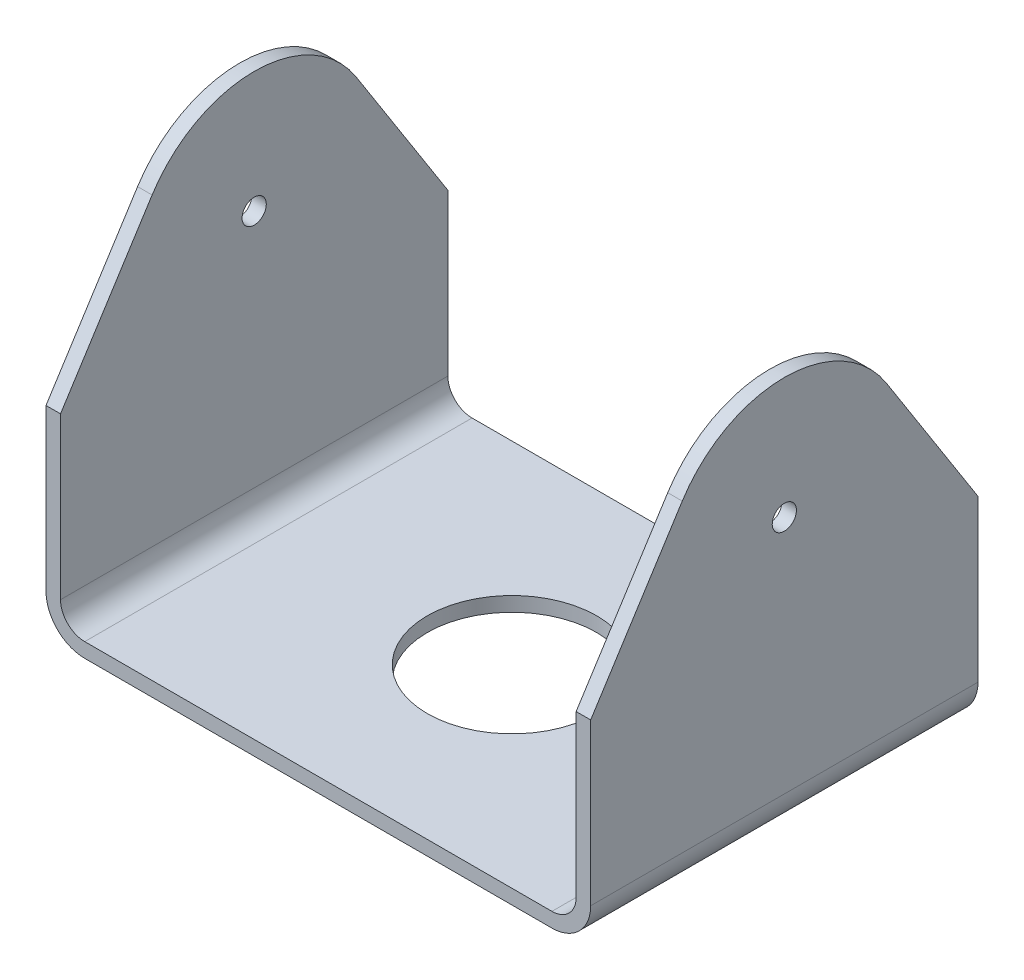
ISO-10303-21;
HEADER;
FILE_DESCRIPTION(('STEP AP214'),'2;1');
FILE_NAME('part.step','',(''),(''),'','','');
FILE_SCHEMA(('AUTOMOTIVE_DESIGN { 1 0 10303 214 1 1 1 1 }'));
ENDSEC;
DATA;
#1=APPLICATION_CONTEXT('core data for automotive mechanical design processes');
#2=APPLICATION_PROTOCOL_DEFINITION('international standard','automotive_design',2000,#1);
#3=PRODUCT_CONTEXT('',#1,'mechanical');
#4=PRODUCT('Part','Part','',(#3));
#5=PRODUCT_RELATED_PRODUCT_CATEGORY('part','',(#4));
#6=PRODUCT_DEFINITION_FORMATION('','',#4);
#7=PRODUCT_DEFINITION_CONTEXT('part definition',#1,'design');
#8=PRODUCT_DEFINITION('design','',#6,#7);
#9=PRODUCT_DEFINITION_SHAPE('','',#8);
#10=(LENGTH_UNIT() NAMED_UNIT(*) SI_UNIT(.MILLI.,.METRE.));
#11=(NAMED_UNIT(*) PLANE_ANGLE_UNIT() SI_UNIT($,.RADIAN.));
#12=(NAMED_UNIT(*) SI_UNIT($,.STERADIAN.) SOLID_ANGLE_UNIT());
#13=UNCERTAINTY_MEASURE_WITH_UNIT(LENGTH_MEASURE(1.E-05),#10,'distance_accuracy_value','');
#14=(GEOMETRIC_REPRESENTATION_CONTEXT(3) GLOBAL_UNCERTAINTY_ASSIGNED_CONTEXT((#13)) GLOBAL_UNIT_ASSIGNED_CONTEXT((#10,
#11,#12)) REPRESENTATION_CONTEXT('',''));
#15=CARTESIAN_POINT('',(0.,0.,0.));
#16=DIRECTION('',(0.,0.,1.));
#17=DIRECTION('',(1.,0.,0.));
#18=AXIS2_PLACEMENT_3D('',#15,#16,#17);
#19=CARTESIAN_POINT('',(56.25,8.,40.));
#20=DIRECTION('',(-1.,0.,0.));
#21=DIRECTION('',(0.,-1.,0.));
#22=AXIS2_PLACEMENT_3D('',#19,#20,#21);
#23=PLANE('',#22);
#24=CARTESIAN_POINT('',(56.25,57.5,0.));
#25=DIRECTION('',(1.,0.,0.));
#26=DIRECTION('',(0.,1.,0.));
#27=AXIS2_PLACEMENT_3D('',#24,#25,#26);
#28=CIRCLE('',#27,2.5);
#29=CARTESIAN_POINT('',(56.25,60.,0.));
#30=VERTEX_POINT('',#29);
#31=EDGE_CURVE('E330',#30,#30,#28,.T.);
#32=ORIENTED_EDGE('',*,*,#31,.F.);
#33=EDGE_LOOP('',(#32));
#34=FACE_BOUND('',#33,.T.);
#35=DIRECTION('',(0.,0.843391445812885,-0.537299608346825));
#36=VECTOR('',#35,1.);
#37=CARTESIAN_POINT('',(56.25,70.9324902086706,21.0847861453221));
#38=LINE('',#37,#36);
#39=CARTESIAN_POINT('',(56.25,41.2415518328899,40.));
#40=VERTEX_POINT('',#39);
#41=CARTESIAN_POINT('',(56.25,70.9324902086707,21.0847861453221));
#42=VERTEX_POINT('',#41);
#43=EDGE_CURVE('E177',#40,#42,#38,.T.);
#44=ORIENTED_EDGE('',*,*,#43,.F.);
#45=DIRECTION('',(0.,1.,0.));
#46=VECTOR('',#45,1.);
#47=CARTESIAN_POINT('',(56.25,8.,40.));
#48=LINE('',#47,#46);
#49=CARTESIAN_POINT('',(56.25,8.,40.));
#50=VERTEX_POINT('',#49);
#51=EDGE_CURVE('E220',#50,#40,#48,.T.);
#52=ORIENTED_EDGE('',*,*,#51,.F.);
#53=DIRECTION('',(0.,0.,-1.));
#54=VECTOR('',#53,1.);
#55=CARTESIAN_POINT('',(56.25,8.,40.));
#56=LINE('',#55,#54);
#57=CARTESIAN_POINT('',(56.25,8.,-40.));
#58=VERTEX_POINT('',#57);
#59=EDGE_CURVE('E244',#50,#58,#56,.T.);
#60=ORIENTED_EDGE('',*,*,#59,.T.);
#61=DIRECTION('',(0.,1.,0.));
#62=VECTOR('',#61,1.);
#63=CARTESIAN_POINT('',(56.25,8.,-40.));
#64=LINE('',#63,#62);
#65=CARTESIAN_POINT('',(56.25,41.2415518328899,-40.));
#66=VERTEX_POINT('',#65);
#67=EDGE_CURVE('E152',#58,#66,#64,.T.);
#68=ORIENTED_EDGE('',*,*,#67,.T.);
#69=DIRECTION('',(0.,-0.843391445812885,-0.537299608346824));
#70=VECTOR('',#69,1.);
#71=CARTESIAN_POINT('',(56.25,70.9324902086706,-21.0847861453221));
#72=LINE('',#71,#70);
#73=CARTESIAN_POINT('',(56.25,70.9324902086707,-21.0847861453221));
#74=VERTEX_POINT('',#73);
#75=EDGE_CURVE('E167',#74,#66,#72,.T.);
#76=ORIENTED_EDGE('',*,*,#75,.F.);
#77=CARTESIAN_POINT('',(56.25,57.5,0.));
#78=DIRECTION('',(-1.,0.,0.));
#79=DIRECTION('',(0.,1.,0.));
#80=AXIS2_PLACEMENT_3D('',#77,#78,#79);
#81=CIRCLE('',#80,25.);
#82=EDGE_CURVE('E46',#42,#74,#81,.T.);
#83=ORIENTED_EDGE('',*,*,#82,.F.);
#84=EDGE_LOOP('',(#44,#52,#60,#68,#76,#83));
#85=FACE_BOUND('',#84,.T.);
#86=ADVANCED_FACE('F32',(#34,#85),#23,.F.);
#87=CARTESIAN_POINT('',(53.25,8.,40.));
#88=DIRECTION('',(-1.,0.,0.));
#89=DIRECTION('',(0.,-1.,0.));
#90=AXIS2_PLACEMENT_3D('',#87,#88,#89);
#91=PLANE('',#90);
#92=CARTESIAN_POINT('',(53.25,57.5,0.));
#93=DIRECTION('',(-1.,0.,0.));
#94=DIRECTION('',(0.,-1.,0.));
#95=AXIS2_PLACEMENT_3D('',#92,#93,#94);
#96=CIRCLE('',#95,2.5);
#97=CARTESIAN_POINT('',(53.25,55.,0.));
#98=VERTEX_POINT('',#97);
#99=EDGE_CURVE('E411',#98,#98,#96,.T.);
#100=ORIENTED_EDGE('',*,*,#99,.F.);
#101=EDGE_LOOP('',(#100));
#102=FACE_BOUND('',#101,.T.);
#103=DIRECTION('',(0.,1.,0.));
#104=VECTOR('',#103,1.);
#105=CARTESIAN_POINT('',(53.25,8.,40.));
#106=LINE('',#105,#104);
#107=CARTESIAN_POINT('',(53.25,8.,40.));
#108=VERTEX_POINT('',#107);
#109=CARTESIAN_POINT('',(53.25,41.2415518328899,40.));
#110=VERTEX_POINT('',#109);
#111=EDGE_CURVE('E223',#108,#110,#106,.T.);
#112=ORIENTED_EDGE('',*,*,#111,.T.);
#113=DIRECTION('',(0.,0.843391445812885,-0.537299608346825));
#114=VECTOR('',#113,1.);
#115=CARTESIAN_POINT('',(53.25,17.5965324898553,55.0635386396653));
#116=LINE('',#115,#114);
#117=CARTESIAN_POINT('',(53.25,70.9324902086707,21.0847861453221));
#118=VERTEX_POINT('',#117);
#119=EDGE_CURVE('E192',#110,#118,#116,.T.);
#120=ORIENTED_EDGE('',*,*,#119,.T.);
#121=CARTESIAN_POINT('',(53.25,57.5,0.));
#122=DIRECTION('',(-1.,0.,0.));
#123=DIRECTION('',(0.,-1.,0.));
#124=AXIS2_PLACEMENT_3D('',#121,#122,#123);
#125=CIRCLE('',#124,25.);
#126=CARTESIAN_POINT('',(53.25,70.9324902086707,-21.0847861453221));
#127=VERTEX_POINT('',#126);
#128=EDGE_CURVE('E159',#118,#127,#125,.T.);
#129=ORIENTED_EDGE('',*,*,#128,.T.);
#130=DIRECTION('',(0.,-0.843391445812885,-0.537299608346824));
#131=VECTOR('',#130,1.);
#132=CARTESIAN_POINT('',(53.25,53.8488439713213,-31.9682691092932));
#133=LINE('',#132,#131);
#134=CARTESIAN_POINT('',(53.25,41.2415518328899,-40.));
#135=VERTEX_POINT('',#134);
#136=EDGE_CURVE('E155',#127,#135,#133,.T.);
#137=ORIENTED_EDGE('',*,*,#136,.T.);
#138=DIRECTION('',(0.,1.,0.));
#139=VECTOR('',#138,1.);
#140=CARTESIAN_POINT('',(53.25,8.,-40.));
#141=LINE('',#140,#139);
#142=CARTESIAN_POINT('',(53.25,8.,-40.));
#143=VERTEX_POINT('',#142);
#144=EDGE_CURVE('E141',#143,#135,#141,.T.);
#145=ORIENTED_EDGE('',*,*,#144,.F.);
#146=DIRECTION('',(0.,0.,-1.));
#147=VECTOR('',#146,1.);
#148=CARTESIAN_POINT('',(53.25,8.,40.));
#149=LINE('',#148,#147);
#150=EDGE_CURVE('E263',#108,#143,#149,.T.);
#151=ORIENTED_EDGE('',*,*,#150,.F.);
#152=EDGE_LOOP('',(#112,#120,#129,#137,#145,#151));
#153=FACE_BOUND('',#152,.T.);
#154=ADVANCED_FACE('F157',(#102,#153),#91,.T.);
#155=CARTESIAN_POINT('',(-53.25,82.5,40.));
#156=DIRECTION('',(1.,0.,0.));
#157=DIRECTION('',(0.,1.,0.));
#158=AXIS2_PLACEMENT_3D('',#155,#156,#157);
#159=PLANE('',#158);
#160=CARTESIAN_POINT('',(-53.25,57.5,0.));
#161=DIRECTION('',(1.,0.,0.));
#162=DIRECTION('',(0.,1.,0.));
#163=AXIS2_PLACEMENT_3D('',#160,#161,#162);
#164=CIRCLE('',#163,2.5);
#165=CARTESIAN_POINT('',(-53.25,60.,0.));
#166=VERTEX_POINT('',#165);
#167=EDGE_CURVE('E406',#166,#166,#164,.T.);
#168=ORIENTED_EDGE('',*,*,#167,.F.);
#169=EDGE_LOOP('',(#168));
#170=FACE_BOUND('',#169,.T.);
#171=CARTESIAN_POINT('',(-53.25,57.5,0.));
#172=DIRECTION('',(1.,0.,0.));
#173=DIRECTION('',(0.,1.,0.));
#174=AXIS2_PLACEMENT_3D('',#171,#172,#173);
#175=CIRCLE('',#174,25.);
#176=CARTESIAN_POINT('',(-53.25,70.9324902086707,-21.0847861453221));
#177=VERTEX_POINT('',#176);
#178=CARTESIAN_POINT('',(-53.25,70.9324902086707,21.0847861453221));
#179=VERTEX_POINT('',#178);
#180=EDGE_CURVE('E194',#177,#179,#175,.T.);
#181=ORIENTED_EDGE('',*,*,#180,.T.);
#182=DIRECTION('',(0.,-0.843391445812885,0.537299608346825));
#183=VECTOR('',#182,1.);
#184=CARTESIAN_POINT('',(-53.25,70.5890627396963,21.30357357255));
#185=LINE('',#184,#183);
#186=CARTESIAN_POINT('',(-53.25,41.2415518328899,40.));
#187=VERTEX_POINT('',#186);
#188=EDGE_CURVE('E190',#179,#187,#185,.T.);
#189=ORIENTED_EDGE('',*,*,#188,.T.);
#190=DIRECTION('',(0.,-1.,0.));
#191=VECTOR('',#190,1.);
#192=CARTESIAN_POINT('',(-53.25,82.5,40.));
#193=LINE('',#192,#191);
#194=CARTESIAN_POINT('',(-53.25,8.,40.));
#195=VERTEX_POINT('',#194);
#196=EDGE_CURVE('E234',#187,#195,#193,.T.);
#197=ORIENTED_EDGE('',*,*,#196,.T.);
#198=DIRECTION('',(0.,0.,-1.));
#199=VECTOR('',#198,1.);
#200=CARTESIAN_POINT('',(-53.25,8.,40.));
#201=LINE('',#200,#199);
#202=CARTESIAN_POINT('',(-53.25,8.,-40.));
#203=VERTEX_POINT('',#202);
#204=EDGE_CURVE('E256',#195,#203,#201,.T.);
#205=ORIENTED_EDGE('',*,*,#204,.T.);
#206=DIRECTION('',(0.,-1.,0.));
#207=VECTOR('',#206,1.);
#208=CARTESIAN_POINT('',(-53.25,82.5,-40.));
#209=LINE('',#208,#207);
#210=CARTESIAN_POINT('',(-53.25,41.2415518328899,-40.));
#211=VERTEX_POINT('',#210);
#212=EDGE_CURVE('E210',#211,#203,#209,.T.);
#213=ORIENTED_EDGE('',*,*,#212,.F.);
#214=DIRECTION('',(0.,0.843391445812885,0.537299608346824));
#215=VECTOR('',#214,1.);
#216=CARTESIAN_POINT('',(-53.25,106.841374221162,1.79169595782202));
#217=LINE('',#216,#215);
#218=EDGE_CURVE('E163',#211,#177,#217,.T.);
#219=ORIENTED_EDGE('',*,*,#218,.T.);
#220=EDGE_LOOP('',(#181,#189,#197,#205,#213,#219));
#221=FACE_BOUND('',#220,.T.);
#222=ADVANCED_FACE('F294',(#170,#221),#159,.T.);
#223=CARTESIAN_POINT('',(-56.25,82.5,40.));
#224=DIRECTION('',(1.,0.,0.));
#225=DIRECTION('',(0.,1.,0.));
#226=AXIS2_PLACEMENT_3D('',#223,#224,#225);
#227=PLANE('',#226);
#228=CARTESIAN_POINT('',(-56.25,57.5,0.));
#229=DIRECTION('',(1.,0.,0.));
#230=DIRECTION('',(0.,1.,0.));
#231=AXIS2_PLACEMENT_3D('',#228,#229,#230);
#232=CIRCLE('',#231,2.5);
#233=CARTESIAN_POINT('',(-56.25,60.,0.));
#234=VERTEX_POINT('',#233);
#235=EDGE_CURVE('E409',#234,#234,#232,.T.);
#236=ORIENTED_EDGE('',*,*,#235,.T.);
#237=EDGE_LOOP('',(#236));
#238=FACE_BOUND('',#237,.T.);
#239=DIRECTION('',(0.,-0.843391445812885,0.537299608346825));
#240=VECTOR('',#239,1.);
#241=CARTESIAN_POINT('',(-56.25,70.5890627396963,21.30357357255));
#242=LINE('',#241,#240);
#243=CARTESIAN_POINT('',(-56.25,70.9324902086707,21.0847861453221));
#244=VERTEX_POINT('',#243);
#245=CARTESIAN_POINT('',(-56.25,41.2415518328899,40.));
#246=VERTEX_POINT('',#245);
#247=EDGE_CURVE('E162',#244,#246,#242,.T.);
#248=ORIENTED_EDGE('',*,*,#247,.F.);
#249=CARTESIAN_POINT('',(-56.25,57.5,0.));
#250=DIRECTION('',(1.,0.,0.));
#251=DIRECTION('',(0.,1.,0.));
#252=AXIS2_PLACEMENT_3D('',#249,#250,#251);
#253=CIRCLE('',#252,25.);
#254=CARTESIAN_POINT('',(-56.25,70.9324902086707,-21.0847861453221));
#255=VERTEX_POINT('',#254);
#256=EDGE_CURVE('E11',#255,#244,#253,.T.);
#257=ORIENTED_EDGE('',*,*,#256,.F.);
#258=DIRECTION('',(0.,0.843391445812885,0.537299608346824));
#259=VECTOR('',#258,1.);
#260=CARTESIAN_POINT('',(-56.25,106.841374221162,1.79169595782202));
#261=LINE('',#260,#259);
#262=CARTESIAN_POINT('',(-56.25,41.2415518328899,-40.));
#263=VERTEX_POINT('',#262);
#264=EDGE_CURVE('E184',#263,#255,#261,.T.);
#265=ORIENTED_EDGE('',*,*,#264,.F.);
#266=DIRECTION('',(0.,-1.,0.));
#267=VECTOR('',#266,1.);
#268=CARTESIAN_POINT('',(-56.25,82.5,-40.));
#269=LINE('',#268,#267);
#270=CARTESIAN_POINT('',(-56.25,8.,-40.));
#271=VERTEX_POINT('',#270);
#272=EDGE_CURVE('E212',#263,#271,#269,.T.);
#273=ORIENTED_EDGE('',*,*,#272,.T.);
#274=DIRECTION('',(0.,0.,-1.));
#275=VECTOR('',#274,1.);
#276=CARTESIAN_POINT('',(-56.25,8.,40.));
#277=LINE('',#276,#275);
#278=CARTESIAN_POINT('',(-56.25,8.,40.));
#279=VERTEX_POINT('',#278);
#280=EDGE_CURVE('E253',#279,#271,#277,.T.);
#281=ORIENTED_EDGE('',*,*,#280,.F.);
#282=DIRECTION('',(0.,-1.,0.));
#283=VECTOR('',#282,1.);
#284=CARTESIAN_POINT('',(-56.25,82.5,40.));
#285=LINE('',#284,#283);
#286=EDGE_CURVE('E236',#246,#279,#285,.T.);
#287=ORIENTED_EDGE('',*,*,#286,.F.);
#288=EDGE_LOOP('',(#248,#257,#265,#273,#281,#287));
#289=FACE_BOUND('',#288,.T.);
#290=ADVANCED_FACE('F278',(#238,#289),#227,.F.);
#291=CARTESIAN_POINT('',(48.25,8.,40.));
#292=DIRECTION('',(0.,0.,1.));
#293=DIRECTION('',(1.,0.,0.));
#294=AXIS2_PLACEMENT_3D('',#291,#292,#293);
#295=PLANE('',#294);
#296=ORIENTED_EDGE('',*,*,#51,.T.);
#297=DIRECTION('',(-1.,0.,0.));
#298=VECTOR('',#297,1.);
#299=CARTESIAN_POINT('',(56.25,41.2415518328899,40.));
#300=LINE('',#299,#298);
#301=EDGE_CURVE('E181',#40,#110,#300,.T.);
#302=ORIENTED_EDGE('',*,*,#301,.T.);
#303=ORIENTED_EDGE('',*,*,#111,.F.);
#304=CARTESIAN_POINT('',(48.25,8.,40.));
#305=DIRECTION('',(0.,0.,1.));
#306=DIRECTION('',(1.,0.,0.));
#307=AXIS2_PLACEMENT_3D('',#304,#305,#306);
#308=CIRCLE('',#307,5.);
#309=CARTESIAN_POINT('',(48.25,3.,40.));
#310=VERTEX_POINT('',#309);
#311=EDGE_CURVE('E225',#310,#108,#308,.T.);
#312=ORIENTED_EDGE('',*,*,#311,.F.);
#313=DIRECTION('',(1.,0.,0.));
#314=VECTOR('',#313,1.);
#315=CARTESIAN_POINT('',(-48.25,3.,40.));
#316=LINE('',#315,#314);
#317=CARTESIAN_POINT('',(-48.25,3.,40.));
#318=VERTEX_POINT('',#317);
#319=EDGE_CURVE('E228',#318,#310,#316,.T.);
#320=ORIENTED_EDGE('',*,*,#319,.F.);
#321=CARTESIAN_POINT('',(-48.25,8.,40.));
#322=DIRECTION('',(0.,0.,1.));
#323=DIRECTION('',(1.,0.,0.));
#324=AXIS2_PLACEMENT_3D('',#321,#322,#323);
#325=CIRCLE('',#324,5.00000000000001);
#326=EDGE_CURVE('E231',#195,#318,#325,.T.);
#327=ORIENTED_EDGE('',*,*,#326,.F.);
#328=ORIENTED_EDGE('',*,*,#196,.F.);
#329=DIRECTION('',(-1.,0.,0.));
#330=VECTOR('',#329,1.);
#331=CARTESIAN_POINT('',(48.25,41.2415518328899,40.));
#332=LINE('',#331,#330);
#333=EDGE_CURVE('E39',#187,#246,#332,.T.);
#334=ORIENTED_EDGE('',*,*,#333,.T.);
#335=ORIENTED_EDGE('',*,*,#286,.T.);
#336=CARTESIAN_POINT('',(-48.25,8.,40.));
#337=DIRECTION('',(0.,0.,1.));
#338=DIRECTION('',(1.,0.,0.));
#339=AXIS2_PLACEMENT_3D('',#336,#337,#338);
#340=CIRCLE('',#339,8.00000000000001);
#341=CARTESIAN_POINT('',(-48.25,0.,40.));
#342=VERTEX_POINT('',#341);
#343=EDGE_CURVE('E238',#279,#342,#340,.T.);
#344=ORIENTED_EDGE('',*,*,#343,.T.);
#345=DIRECTION('',(1.,0.,0.));
#346=VECTOR('',#345,1.);
#347=CARTESIAN_POINT('',(-48.25,0.,40.));
#348=LINE('',#347,#346);
#349=CARTESIAN_POINT('',(48.25,0.,40.));
#350=VERTEX_POINT('',#349);
#351=EDGE_CURVE('E240',#342,#350,#348,.T.);
#352=ORIENTED_EDGE('',*,*,#351,.T.);
#353=CARTESIAN_POINT('',(48.25,8.,40.));
#354=DIRECTION('',(0.,0.,1.));
#355=DIRECTION('',(1.,0.,0.));
#356=AXIS2_PLACEMENT_3D('',#353,#354,#355);
#357=CIRCLE('',#356,8.);
#358=EDGE_CURVE('E242',#350,#50,#357,.T.);
#359=ORIENTED_EDGE('',*,*,#358,.T.);
#360=EDGE_LOOP('',(#296,#302,#303,#312,#320,#327,#328,#334,#335,#344,#352,#359));
#361=FACE_BOUND('',#360,.T.);
#362=ADVANCED_FACE('F271',(#361),#295,.T.);
#363=CARTESIAN_POINT('',(48.25,8.,-40.));
#364=DIRECTION('',(0.,0.,1.));
#365=DIRECTION('',(1.,0.,0.));
#366=AXIS2_PLACEMENT_3D('',#363,#364,#365);
#367=PLANE('',#366);
#368=DIRECTION('',(-1.,0.,0.));
#369=VECTOR('',#368,1.);
#370=CARTESIAN_POINT('',(56.25,41.2415518328899,-40.));
#371=LINE('',#370,#369);
#372=EDGE_CURVE('E146',#66,#135,#371,.T.);
#373=ORIENTED_EDGE('',*,*,#372,.F.);
#374=ORIENTED_EDGE('',*,*,#67,.F.);
#375=CARTESIAN_POINT('',(48.25,8.,-40.));
#376=DIRECTION('',(0.,0.,1.));
#377=DIRECTION('',(1.,0.,0.));
#378=AXIS2_PLACEMENT_3D('',#375,#376,#377);
#379=CIRCLE('',#378,8.);
#380=CARTESIAN_POINT('',(48.25,0.,-40.));
#381=VERTEX_POINT('',#380);
#382=EDGE_CURVE('E218',#381,#58,#379,.T.);
#383=ORIENTED_EDGE('',*,*,#382,.F.);
#384=DIRECTION('',(1.,0.,0.));
#385=VECTOR('',#384,1.);
#386=CARTESIAN_POINT('',(-48.25,0.,-40.));
#387=LINE('',#386,#385);
#388=CARTESIAN_POINT('',(-48.25,0.,-40.));
#389=VERTEX_POINT('',#388);
#390=EDGE_CURVE('E216',#389,#381,#387,.T.);
#391=ORIENTED_EDGE('',*,*,#390,.F.);
#392=CARTESIAN_POINT('',(-48.25,8.,-40.));
#393=DIRECTION('',(0.,0.,1.));
#394=DIRECTION('',(1.,0.,0.));
#395=AXIS2_PLACEMENT_3D('',#392,#393,#394);
#396=CIRCLE('',#395,8.00000000000001);
#397=EDGE_CURVE('E214',#271,#389,#396,.T.);
#398=ORIENTED_EDGE('',*,*,#397,.F.);
#399=ORIENTED_EDGE('',*,*,#272,.F.);
#400=DIRECTION('',(-1.,0.,0.));
#401=VECTOR('',#400,1.);
#402=CARTESIAN_POINT('',(48.25,41.2415518328899,-40.));
#403=LINE('',#402,#401);
#404=EDGE_CURVE('E265',#211,#263,#403,.T.);
#405=ORIENTED_EDGE('',*,*,#404,.F.);
#406=ORIENTED_EDGE('',*,*,#212,.T.);
#407=CARTESIAN_POINT('',(-48.25,8.,-40.));
#408=DIRECTION('',(0.,0.,1.));
#409=DIRECTION('',(1.,0.,0.));
#410=AXIS2_PLACEMENT_3D('',#407,#408,#409);
#411=CIRCLE('',#410,5.00000000000001);
#412=CARTESIAN_POINT('',(-48.25,3.,-40.));
#413=VERTEX_POINT('',#412);
#414=EDGE_CURVE('E207',#203,#413,#411,.T.);
#415=ORIENTED_EDGE('',*,*,#414,.T.);
#416=DIRECTION('',(1.,0.,0.));
#417=VECTOR('',#416,1.);
#418=CARTESIAN_POINT('',(-48.25,3.,-40.));
#419=LINE('',#418,#417);
#420=CARTESIAN_POINT('',(48.25,3.,-40.));
#421=VERTEX_POINT('',#420);
#422=EDGE_CURVE('E205',#413,#421,#419,.T.);
#423=ORIENTED_EDGE('',*,*,#422,.T.);
#424=CARTESIAN_POINT('',(48.25,8.,-40.));
#425=DIRECTION('',(0.,0.,1.));
#426=DIRECTION('',(1.,0.,0.));
#427=AXIS2_PLACEMENT_3D('',#424,#425,#426);
#428=CIRCLE('',#427,5.);
#429=EDGE_CURVE('E150',#421,#143,#428,.T.);
#430=ORIENTED_EDGE('',*,*,#429,.T.);
#431=ORIENTED_EDGE('',*,*,#144,.T.);
#432=EDGE_LOOP('',(#373,#374,#383,#391,#398,#399,#405,#406,#415,#423,#430,#431));
#433=FACE_BOUND('',#432,.T.);
#434=ADVANCED_FACE('F143',(#433),#367,.F.);
#435=CARTESIAN_POINT('',(48.25,8.,40.));
#436=DIRECTION('',(0.,0.,-1.));
#437=DIRECTION('',(-1.,0.,0.));
#438=AXIS2_PLACEMENT_3D('',#435,#436,#437);
#439=CYLINDRICAL_SURFACE('',#438,5.);
#440=ORIENTED_EDGE('',*,*,#429,.F.);
#441=DIRECTION('',(0.,0.,-1.));
#442=VECTOR('',#441,1.);
#443=CARTESIAN_POINT('',(48.25,3.,40.));
#444=LINE('',#443,#442);
#445=EDGE_CURVE('E261',#310,#421,#444,.T.);
#446=ORIENTED_EDGE('',*,*,#445,.F.);
#447=ORIENTED_EDGE('',*,*,#311,.T.);
#448=ORIENTED_EDGE('',*,*,#150,.T.);
#449=EDGE_LOOP('',(#440,#446,#447,#448));
#450=FACE_BOUND('',#449,.T.);
#451=ADVANCED_FACE('F305',(#450),#439,.F.);
#452=CARTESIAN_POINT('',(-48.25,3.,40.));
#453=DIRECTION('',(0.,1.,0.));
#454=DIRECTION('',(0.,0.,1.));
#455=AXIS2_PLACEMENT_3D('',#452,#453,#454);
#456=PLANE('',#455);
#457=CARTESIAN_POINT('',(0.,3.,0.));
#458=DIRECTION('',(0.,1.,0.));
#459=DIRECTION('',(0.,0.,1.));
#460=AXIS2_PLACEMENT_3D('',#457,#458,#459);
#461=CIRCLE('',#460,17.5);
#462=CARTESIAN_POINT('',(0.,3.,17.5));
#463=VERTEX_POINT('',#462);
#464=EDGE_CURVE('E197',#463,#463,#461,.T.);
#465=ORIENTED_EDGE('',*,*,#464,.F.);
#466=EDGE_LOOP('',(#465));
#467=FACE_BOUND('',#466,.T.);
#468=ORIENTED_EDGE('',*,*,#422,.F.);
#469=DIRECTION('',(0.,0.,-1.));
#470=VECTOR('',#469,1.);
#471=CARTESIAN_POINT('',(-48.25,3.,40.));
#472=LINE('',#471,#470);
#473=EDGE_CURVE('E259',#318,#413,#472,.T.);
#474=ORIENTED_EDGE('',*,*,#473,.F.);
#475=ORIENTED_EDGE('',*,*,#319,.T.);
#476=ORIENTED_EDGE('',*,*,#445,.T.);
#477=EDGE_LOOP('',(#468,#474,#475,#476));
#478=FACE_BOUND('',#477,.T.);
#479=ADVANCED_FACE('F301',(#467,#478),#456,.T.);
#480=CARTESIAN_POINT('',(-48.25,8.,40.));
#481=DIRECTION('',(0.,0.,-1.));
#482=DIRECTION('',(-1.,0.,0.));
#483=AXIS2_PLACEMENT_3D('',#480,#481,#482);
#484=CYLINDRICAL_SURFACE('',#483,5.00000000000001);
#485=ORIENTED_EDGE('',*,*,#414,.F.);
#486=ORIENTED_EDGE('',*,*,#204,.F.);
#487=ORIENTED_EDGE('',*,*,#326,.T.);
#488=ORIENTED_EDGE('',*,*,#473,.T.);
#489=EDGE_LOOP('',(#485,#486,#487,#488));
#490=FACE_BOUND('',#489,.T.);
#491=ADVANCED_FACE('F298',(#490),#484,.F.);
#492=CARTESIAN_POINT('',(-48.25,8.,40.));
#493=DIRECTION('',(0.,0.,-1.));
#494=DIRECTION('',(-1.,0.,0.));
#495=AXIS2_PLACEMENT_3D('',#492,#493,#494);
#496=CYLINDRICAL_SURFACE('',#495,8.00000000000001);
#497=ORIENTED_EDGE('',*,*,#397,.T.);
#498=DIRECTION('',(0.,0.,-1.));
#499=VECTOR('',#498,1.);
#500=CARTESIAN_POINT('',(-48.25,0.,40.));
#501=LINE('',#500,#499);
#502=EDGE_CURVE('E250',#342,#389,#501,.T.);
#503=ORIENTED_EDGE('',*,*,#502,.F.);
#504=ORIENTED_EDGE('',*,*,#343,.F.);
#505=ORIENTED_EDGE('',*,*,#280,.T.);
#506=EDGE_LOOP('',(#497,#503,#504,#505));
#507=FACE_BOUND('',#506,.T.);
#508=ADVANCED_FACE('F343',(#507),#496,.T.);
#509=CARTESIAN_POINT('',(-48.25,0.,40.));
#510=DIRECTION('',(0.,1.,0.));
#511=DIRECTION('',(0.,0.,1.));
#512=AXIS2_PLACEMENT_3D('',#509,#510,#511);
#513=PLANE('',#512);
#514=CARTESIAN_POINT('',(0.,0.,0.));
#515=DIRECTION('',(0.,1.,0.));
#516=DIRECTION('',(0.,0.,1.));
#517=AXIS2_PLACEMENT_3D('',#514,#515,#516);
#518=CIRCLE('',#517,17.5);
#519=CARTESIAN_POINT('',(0.,0.,17.5));
#520=VERTEX_POINT('',#519);
#521=EDGE_CURVE('E200',#520,#520,#518,.F.);
#522=ORIENTED_EDGE('',*,*,#521,.F.);
#523=EDGE_LOOP('',(#522));
#524=FACE_BOUND('',#523,.T.);
#525=ORIENTED_EDGE('',*,*,#390,.T.);
#526=DIRECTION('',(0.,0.,-1.));
#527=VECTOR('',#526,1.);
#528=CARTESIAN_POINT('',(48.25,0.,40.));
#529=LINE('',#528,#527);
#530=EDGE_CURVE('E247',#350,#381,#529,.T.);
#531=ORIENTED_EDGE('',*,*,#530,.F.);
#532=ORIENTED_EDGE('',*,*,#351,.F.);
#533=ORIENTED_EDGE('',*,*,#502,.T.);
#534=EDGE_LOOP('',(#525,#531,#532,#533));
#535=FACE_BOUND('',#534,.T.);
#536=ADVANCED_FACE('F340',(#524,#535),#513,.F.);
#537=CARTESIAN_POINT('',(48.25,8.,40.));
#538=DIRECTION('',(0.,0.,-1.));
#539=DIRECTION('',(-1.,0.,0.));
#540=AXIS2_PLACEMENT_3D('',#537,#538,#539);
#541=CYLINDRICAL_SURFACE('',#540,8.);
#542=ORIENTED_EDGE('',*,*,#382,.T.);
#543=ORIENTED_EDGE('',*,*,#59,.F.);
#544=ORIENTED_EDGE('',*,*,#358,.F.);
#545=ORIENTED_EDGE('',*,*,#530,.T.);
#546=EDGE_LOOP('',(#542,#543,#544,#545));
#547=FACE_BOUND('',#546,.T.);
#548=ADVANCED_FACE('F336',(#547),#541,.T.);
#549=CARTESIAN_POINT('',(0.,-0.00100000000000707,0.));
#550=DIRECTION('',(0.,1.,0.));
#551=DIRECTION('',(0.,0.,1.));
#552=AXIS2_PLACEMENT_3D('',#549,#550,#551);
#553=CYLINDRICAL_SURFACE('',#552,17.5);
#554=ORIENTED_EDGE('',*,*,#464,.T.);
#555=EDGE_LOOP('',(#554));
#556=FACE_BOUND('',#555,.T.);
#557=ORIENTED_EDGE('',*,*,#521,.T.);
#558=EDGE_LOOP('',(#557));
#559=FACE_BOUND('',#558,.T.);
#560=ADVANCED_FACE('F374',(#556,#559),#553,.F.);
#561=CARTESIAN_POINT('',(56.25,70.9324902086706,21.0847861453221));
#562=DIRECTION('',(0.,0.537299608346825,0.843391445812885));
#563=DIRECTION('',(0.,-0.843391445812885,0.537299608346825));
#564=AXIS2_PLACEMENT_3D('',#561,#562,#563);
#565=PLANE('',#564);
#566=ORIENTED_EDGE('',*,*,#188,.F.);
#567=DIRECTION('',(-1.,0.,0.));
#568=VECTOR('',#567,1.);
#569=CARTESIAN_POINT('',(56.25,70.9324902086706,21.0847861453221));
#570=LINE('',#569,#568);
#571=EDGE_CURVE('E168',#179,#244,#570,.T.);
#572=ORIENTED_EDGE('',*,*,#571,.T.);
#573=ORIENTED_EDGE('',*,*,#247,.T.);
#574=ORIENTED_EDGE('',*,*,#333,.F.);
#575=EDGE_LOOP('',(#566,#572,#573,#574));
#576=FACE_BOUND('',#575,.T.);
#577=ADVANCED_FACE('F280',(#576),#565,.T.);
#578=CARTESIAN_POINT('',(56.25,70.9324902086706,-21.0847861453221));
#579=DIRECTION('',(0.,0.537299608346824,-0.843391445812885));
#580=DIRECTION('',(0.,0.843391445812885,0.537299608346824));
#581=AXIS2_PLACEMENT_3D('',#578,#579,#580);
#582=PLANE('',#581);
#583=ORIENTED_EDGE('',*,*,#218,.F.);
#584=ORIENTED_EDGE('',*,*,#404,.T.);
#585=ORIENTED_EDGE('',*,*,#264,.T.);
#586=DIRECTION('',(-1.,0.,0.));
#587=VECTOR('',#586,1.);
#588=CARTESIAN_POINT('',(56.25,70.9324902086706,-21.0847861453221));
#589=LINE('',#588,#587);
#590=EDGE_CURVE('E180',#177,#255,#589,.T.);
#591=ORIENTED_EDGE('',*,*,#590,.F.);
#592=EDGE_LOOP('',(#583,#584,#585,#591));
#593=FACE_BOUND('',#592,.T.);
#594=ADVANCED_FACE('F290',(#593),#582,.T.);
#595=CARTESIAN_POINT('',(56.25,57.5,0.));
#596=DIRECTION('',(-1.,0.,0.));
#597=DIRECTION('',(0.,-1.,0.));
#598=AXIS2_PLACEMENT_3D('',#595,#596,#597);
#599=CYLINDRICAL_SURFACE('',#598,25.);
#600=ORIENTED_EDGE('',*,*,#180,.F.);
#601=ORIENTED_EDGE('',*,*,#590,.T.);
#602=ORIENTED_EDGE('',*,*,#256,.T.);
#603=ORIENTED_EDGE('',*,*,#571,.F.);
#604=EDGE_LOOP('',(#600,#601,#602,#603));
#605=FACE_BOUND('',#604,.T.);
#606=ADVANCED_FACE('F284',(#605),#599,.T.);
#607=ORIENTED_EDGE('',*,*,#82,.T.);
#608=EDGE_CURVE('E173',#74,#127,#589,.T.);
#609=ORIENTED_EDGE('',*,*,#608,.T.);
#610=ORIENTED_EDGE('',*,*,#128,.F.);
#611=EDGE_CURVE('E171',#42,#118,#570,.T.);
#612=ORIENTED_EDGE('',*,*,#611,.F.);
#613=EDGE_LOOP('',(#607,#609,#610,#612));
#614=FACE_BOUND('',#613,.T.);
#615=ADVANCED_FACE('F313',(#614),#599,.T.);
#616=ORIENTED_EDGE('',*,*,#119,.F.);
#617=ORIENTED_EDGE('',*,*,#301,.F.);
#618=ORIENTED_EDGE('',*,*,#43,.T.);
#619=ORIENTED_EDGE('',*,*,#611,.T.);
#620=EDGE_LOOP('',(#616,#617,#618,#619));
#621=FACE_BOUND('',#620,.T.);
#622=ADVANCED_FACE('F312',(#621),#565,.T.);
#623=ORIENTED_EDGE('',*,*,#136,.F.);
#624=ORIENTED_EDGE('',*,*,#608,.F.);
#625=ORIENTED_EDGE('',*,*,#75,.T.);
#626=ORIENTED_EDGE('',*,*,#372,.T.);
#627=EDGE_LOOP('',(#623,#624,#625,#626));
#628=FACE_BOUND('',#627,.T.);
#629=ADVANCED_FACE('F166',(#628),#582,.T.);
#630=CARTESIAN_POINT('',(-56.25,57.5,0.));
#631=DIRECTION('',(1.,0.,0.));
#632=DIRECTION('',(0.,1.,0.));
#633=AXIS2_PLACEMENT_3D('',#630,#631,#632);
#634=CYLINDRICAL_SURFACE('',#633,2.5);
#635=ORIENTED_EDGE('',*,*,#167,.T.);
#636=EDGE_LOOP('',(#635));
#637=FACE_BOUND('',#636,.T.);
#638=ORIENTED_EDGE('',*,*,#235,.F.);
#639=EDGE_LOOP('',(#638));
#640=FACE_BOUND('',#639,.T.);
#641=ADVANCED_FACE('F393',(#637,#640),#634,.F.);
#642=ORIENTED_EDGE('',*,*,#99,.T.);
#643=EDGE_LOOP('',(#642));
#644=FACE_BOUND('',#643,.T.);
#645=ORIENTED_EDGE('',*,*,#31,.T.);
#646=EDGE_LOOP('',(#645));
#647=FACE_BOUND('',#646,.T.);
#648=ADVANCED_FACE('F397',(#644,#647),#634,.F.);
#649=CLOSED_SHELL('',(#86,#154,#222,#290,#362,#434,#451,#479,#491,#508,#536,#548,#560,#577,#594,
#606,#615,#622,#629,#641,#648));
#650=MANIFOLD_SOLID_BREP('B2',#649);
#651=ADVANCED_BREP_SHAPE_REPRESENTATION('',(#18,#650),#14);
#652=SHAPE_DEFINITION_REPRESENTATION(#9,#651);
ENDSEC;
END-ISO-10303-21;
